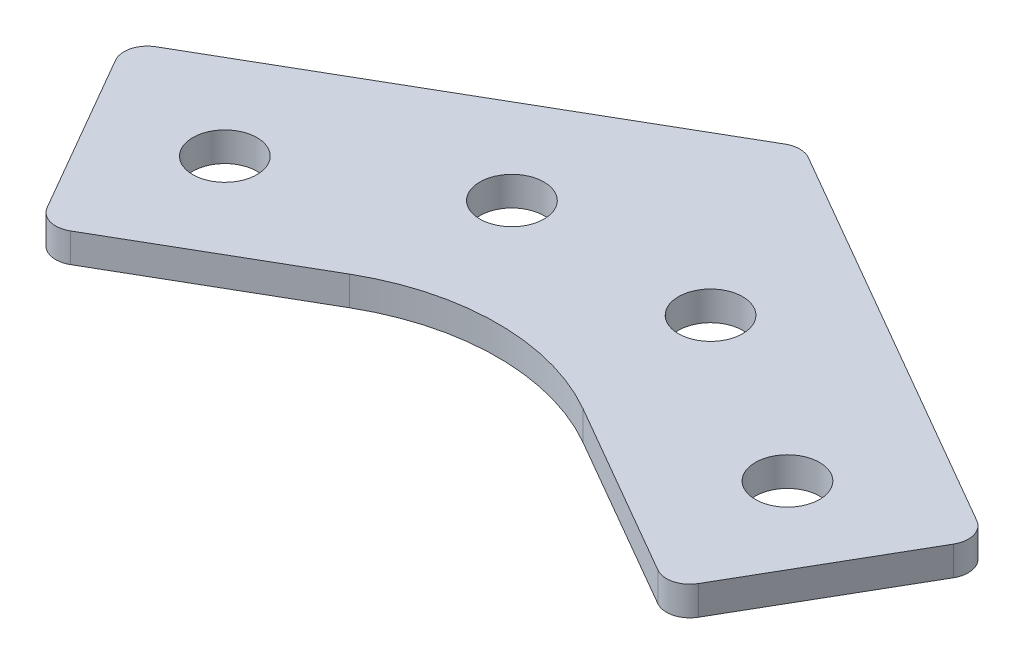
ISO-10303-21;
HEADER;
FILE_DESCRIPTION(('STEP AP214'),'2;1');
FILE_NAME('part.step','',(''),(''),'','','');
FILE_SCHEMA(('AUTOMOTIVE_DESIGN { 1 0 10303 214 1 1 1 1 }'));
ENDSEC;
DATA;
#1=APPLICATION_CONTEXT('core data for automotive mechanical design processes');
#2=APPLICATION_PROTOCOL_DEFINITION('international standard','automotive_design',2000,#1);
#3=PRODUCT_CONTEXT('',#1,'mechanical');
#4=PRODUCT('Part','Part','',(#3));
#5=PRODUCT_RELATED_PRODUCT_CATEGORY('part','',(#4));
#6=PRODUCT_DEFINITION_FORMATION('','',#4);
#7=PRODUCT_DEFINITION_CONTEXT('part definition',#1,'design');
#8=PRODUCT_DEFINITION('design','',#6,#7);
#9=PRODUCT_DEFINITION_SHAPE('','',#8);
#10=(LENGTH_UNIT() NAMED_UNIT(*) SI_UNIT(.MILLI.,.METRE.));
#11=(NAMED_UNIT(*) PLANE_ANGLE_UNIT() SI_UNIT($,.RADIAN.));
#12=(NAMED_UNIT(*) SI_UNIT($,.STERADIAN.) SOLID_ANGLE_UNIT());
#13=UNCERTAINTY_MEASURE_WITH_UNIT(LENGTH_MEASURE(1.E-05),#10,'distance_accuracy_value','');
#14=(GEOMETRIC_REPRESENTATION_CONTEXT(3) GLOBAL_UNCERTAINTY_ASSIGNED_CONTEXT((#13)) GLOBAL_UNIT_ASSIGNED_CONTEXT((#10,
#11,#12)) REPRESENTATION_CONTEXT('',''));
#15=CARTESIAN_POINT('',(0.,0.,0.));
#16=DIRECTION('',(0.,0.,1.));
#17=DIRECTION('',(1.,0.,0.));
#18=AXIS2_PLACEMENT_3D('',#15,#16,#17);
#19=CARTESIAN_POINT('',(-34.1504127601336,3.175,19.71675));
#20=DIRECTION('',(-0.866025403784439,0.,0.5));
#21=DIRECTION('',(0.5,0.,0.866025403784439));
#22=AXIS2_PLACEMENT_3D('',#19,#20,#21);
#23=PLANE('',#22);
#24=DIRECTION('',(-0.5,0.,-0.866025403784439));
#25=VECTOR('',#24,1.);
#26=CARTESIAN_POINT('',(-34.1504127601336,3.175,19.71675));
#27=LINE('',#26,#25);
#28=CARTESIAN_POINT('',(-35.4204127601337,3.175,17.5170454743875));
#29=VERTEX_POINT('',#28);
#30=CARTESIAN_POINT('',(-45.5804127601336,3.175,-0.0805907305122464));
#31=VERTEX_POINT('',#30);
#32=EDGE_CURVE('E230',#29,#31,#27,.T.);
#33=ORIENTED_EDGE('',*,*,#32,.T.);
#34=DIRECTION('',(0.,-1.,0.));
#35=VECTOR('',#34,1.);
#36=CARTESIAN_POINT('',(-45.5804127601336,3.175,-0.0805907305122464));
#37=LINE('',#36,#35);
#38=CARTESIAN_POINT('',(-45.5804127601336,0.,-0.0805907305122464));
#39=VERTEX_POINT('',#38);
#40=EDGE_CURVE('E191',#31,#39,#37,.T.);
#41=ORIENTED_EDGE('',*,*,#40,.T.);
#42=DIRECTION('',(-0.5,0.,-0.866025403784439));
#43=VECTOR('',#42,1.);
#44=CARTESIAN_POINT('',(-34.1504127601336,0.,19.71675));
#45=LINE('',#44,#43);
#46=CARTESIAN_POINT('',(-35.4204127601337,0.,17.5170454743875));
#47=VERTEX_POINT('',#46);
#48=EDGE_CURVE('E131',#47,#39,#45,.T.);
#49=ORIENTED_EDGE('',*,*,#48,.F.);
#50=DIRECTION('',(0.,-1.,0.));
#51=VECTOR('',#50,1.);
#52=CARTESIAN_POINT('',(-35.4204127601337,3.175,17.5170454743875));
#53=LINE('',#52,#51);
#54=EDGE_CURVE('E189',#47,#29,#53,.F.);
#55=ORIENTED_EDGE('',*,*,#54,.T.);
#56=EDGE_LOOP('',(#33,#41,#49,#55));
#57=FACE_BOUND('',#56,.T.);
#58=ADVANCED_FACE('F40',(#57),#23,.T.);
#59=CARTESIAN_POINT('',(0.,3.175,0.));
#60=DIRECTION('',(0.5,0.,0.866025403784438));
#61=DIRECTION('',(0.866025403784439,0.,-0.5));
#62=AXIS2_PLACEMENT_3D('',#59,#60,#61);
#63=PLANE('',#62);
#64=DIRECTION('',(-0.866025403784439,0.,0.5));
#65=VECTOR('',#64,1.);
#66=CARTESIAN_POINT('',(0.,0.,0.));
#67=LINE('',#66,#65);
#68=CARTESIAN_POINT('',(-12.7,0.,7.33234841870828));
#69=VERTEX_POINT('',#68);
#70=CARTESIAN_POINT('',(-31.9507082345212,0.,18.44675));
#71=VERTEX_POINT('',#70);
#72=EDGE_CURVE('E212',#69,#71,#67,.T.);
#73=ORIENTED_EDGE('',*,*,#72,.F.);
#74=DIRECTION('',(0.,-1.,0.));
#75=VECTOR('',#74,1.);
#76=CARTESIAN_POINT('',(-12.7,3.175,7.33234841870827));
#77=LINE('',#76,#75);
#78=CARTESIAN_POINT('',(-12.7,3.175,7.33234841870828));
#79=VERTEX_POINT('',#78);
#80=EDGE_CURVE('E61',#69,#79,#77,.F.);
#81=ORIENTED_EDGE('',*,*,#80,.T.);
#82=DIRECTION('',(-0.866025403784439,0.,0.5));
#83=VECTOR('',#82,1.);
#84=CARTESIAN_POINT('',(0.,3.175,0.));
#85=LINE('',#84,#83);
#86=CARTESIAN_POINT('',(-31.9507082345212,3.175,18.44675));
#87=VERTEX_POINT('',#86);
#88=EDGE_CURVE('E233',#79,#87,#85,.T.);
#89=ORIENTED_EDGE('',*,*,#88,.T.);
#90=DIRECTION('',(0.,-1.,0.));
#91=VECTOR('',#90,1.);
#92=CARTESIAN_POINT('',(-31.9507082345212,3.175,18.44675));
#93=LINE('',#92,#91);
#94=EDGE_CURVE('E193',#87,#71,#93,.T.);
#95=ORIENTED_EDGE('',*,*,#94,.T.);
#96=EDGE_LOOP('',(#73,#81,#89,#95));
#97=FACE_BOUND('',#96,.T.);
#98=ADVANCED_FACE('F298',(#97),#63,.T.);
#99=CARTESIAN_POINT('',(34.1504127601336,3.175,19.7167500000001));
#100=DIRECTION('',(-0.500000000000002,0.,0.866025403784437));
#101=DIRECTION('',(0.866025403784438,0.,0.500000000000002));
#102=AXIS2_PLACEMENT_3D('',#99,#100,#101);
#103=PLANE('',#102);
#104=DIRECTION('',(-0.866025403784437,0.,-0.500000000000002));
#105=VECTOR('',#104,1.);
#106=CARTESIAN_POINT('',(34.1504127601336,3.175,19.7167500000001));
#107=LINE('',#106,#105);
#108=CARTESIAN_POINT('',(31.9507082345211,3.175,18.4467500000001));
#109=VERTEX_POINT('',#108);
#110=CARTESIAN_POINT('',(12.7,3.175,7.33234841870829));
#111=VERTEX_POINT('',#110);
#112=EDGE_CURVE('E207',#109,#111,#107,.T.);
#113=ORIENTED_EDGE('',*,*,#112,.T.);
#114=DIRECTION('',(0.,-1.,0.));
#115=VECTOR('',#114,1.);
#116=CARTESIAN_POINT('',(12.7,0.,7.33234841870829));
#117=LINE('',#116,#115);
#118=CARTESIAN_POINT('',(12.7,0.,7.33234841870829));
#119=VERTEX_POINT('',#118);
#120=EDGE_CURVE('E196',#111,#119,#117,.T.);
#121=ORIENTED_EDGE('',*,*,#120,.T.);
#122=DIRECTION('',(-0.866025403784437,0.,-0.500000000000002));
#123=VECTOR('',#122,1.);
#124=CARTESIAN_POINT('',(34.1504127601336,0.,19.7167500000001));
#125=LINE('',#124,#123);
#126=CARTESIAN_POINT('',(31.9507082345211,0.,18.4467500000001));
#127=VERTEX_POINT('',#126);
#128=EDGE_CURVE('E204',#127,#119,#125,.T.);
#129=ORIENTED_EDGE('',*,*,#128,.F.);
#130=DIRECTION('',(0.,-1.,0.));
#131=VECTOR('',#130,1.);
#132=CARTESIAN_POINT('',(31.9507082345211,3.175,18.4467500000001));
#133=LINE('',#132,#131);
#134=EDGE_CURVE('E187',#127,#109,#133,.F.);
#135=ORIENTED_EDGE('',*,*,#134,.T.);
#136=EDGE_LOOP('',(#113,#121,#129,#135));
#137=FACE_BOUND('',#136,.T.);
#138=ADVANCED_FACE('F203',(#137),#103,.T.);
#139=CARTESIAN_POINT('',(34.1504127601336,3.175,19.7167500000001));
#140=DIRECTION('',(-0.866025403784438,0.,-0.500000000000002));
#141=DIRECTION('',(-0.500000000000002,0.,0.866025403784438));
#142=AXIS2_PLACEMENT_3D('',#139,#140,#141);
#143=PLANE('',#142);
#144=DIRECTION('',(0.500000000000002,0.,-0.866025403784438));
#145=VECTOR('',#144,1.);
#146=CARTESIAN_POINT('',(34.1504127601336,0.,19.7167500000001));
#147=LINE('',#146,#145);
#148=CARTESIAN_POINT('',(35.4204127601336,0.,17.5170454743876));
#149=VERTEX_POINT('',#148);
#150=CARTESIAN_POINT('',(45.5804127601337,0.,-0.0805907305121978));
#151=VERTEX_POINT('',#150);
#152=EDGE_CURVE('E211',#149,#151,#147,.T.);
#153=ORIENTED_EDGE('',*,*,#152,.T.);
#154=DIRECTION('',(0.,-1.,0.));
#155=VECTOR('',#154,1.);
#156=CARTESIAN_POINT('',(45.5804127601337,3.175,-0.0805907305121976));
#157=LINE('',#156,#155);
#158=CARTESIAN_POINT('',(45.5804127601337,3.175,-0.0805907305121978));
#159=VERTEX_POINT('',#158);
#160=EDGE_CURVE('E185',#151,#159,#157,.F.);
#161=ORIENTED_EDGE('',*,*,#160,.T.);
#162=DIRECTION('',(0.500000000000002,0.,-0.866025403784438));
#163=VECTOR('',#162,1.);
#164=CARTESIAN_POINT('',(34.1504127601336,3.175,19.7167500000001));
#165=LINE('',#164,#163);
#166=CARTESIAN_POINT('',(35.4204127601336,3.175,17.5170454743876));
#167=VERTEX_POINT('',#166);
#168=EDGE_CURVE('E157',#167,#159,#165,.T.);
#169=ORIENTED_EDGE('',*,*,#168,.F.);
#170=DIRECTION('',(0.,-1.,0.));
#171=VECTOR('',#170,1.);
#172=CARTESIAN_POINT('',(35.4204127601336,0.,17.5170454743876));
#173=LINE('',#172,#171);
#174=EDGE_CURVE('E182',#167,#149,#173,.T.);
#175=ORIENTED_EDGE('',*,*,#174,.T.);
#176=EDGE_LOOP('',(#153,#161,#169,#175));
#177=FACE_BOUND('',#176,.T.);
#178=ADVANCED_FACE('F333',(#177),#143,.F.);
#179=CARTESIAN_POINT('',(0.,3.175,-29.329393674833));
#180=DIRECTION('',(0.500000000000001,0.,-0.866025403784438));
#181=DIRECTION('',(-0.866025403784438,0.,-0.500000000000001));
#182=AXIS2_PLACEMENT_3D('',#179,#180,#181);
#183=PLANE('',#182);
#184=DIRECTION('',(0.866025403784438,0.,0.500000000000001));
#185=VECTOR('',#184,1.);
#186=CARTESIAN_POINT('',(0.,0.,-29.329393674833));
#187=LINE('',#186,#185);
#188=CARTESIAN_POINT('',(1.27,0.,-28.5961588329622));
#189=VERTEX_POINT('',#188);
#190=CARTESIAN_POINT('',(44.6507082345212,0.,-3.55029525612468));
#191=VERTEX_POINT('',#190);
#192=EDGE_CURVE('E148',#189,#191,#187,.T.);
#193=ORIENTED_EDGE('',*,*,#192,.F.);
#194=DIRECTION('',(0.,-1.,0.));
#195=VECTOR('',#194,1.);
#196=CARTESIAN_POINT('',(1.27,3.175,-28.5961588329622));
#197=LINE('',#196,#195);
#198=CARTESIAN_POINT('',(1.27000000000002,3.175,-28.5961588329622));
#199=VERTEX_POINT('',#198);
#200=EDGE_CURVE('E170',#189,#199,#197,.F.);
#201=ORIENTED_EDGE('',*,*,#200,.T.);
#202=DIRECTION('',(-0.866025403784437,0.,-0.500000000000002));
#203=VECTOR('',#202,1.);
#204=CARTESIAN_POINT('',(46.8504127601337,3.175,-2.28029525612464));
#205=LINE('',#204,#203);
#206=CARTESIAN_POINT('',(44.6507082345212,3.175,-3.55029525612465));
#207=VERTEX_POINT('',#206);
#208=EDGE_CURVE('E153',#207,#199,#205,.T.);
#209=ORIENTED_EDGE('',*,*,#208,.F.);
#210=DIRECTION('',(0.,-1.,0.));
#211=VECTOR('',#210,1.);
#212=CARTESIAN_POINT('',(44.6507082345212,0.,-3.55029525612467));
#213=LINE('',#212,#211);
#214=EDGE_CURVE('E167',#207,#191,#213,.T.);
#215=ORIENTED_EDGE('',*,*,#214,.T.);
#216=EDGE_LOOP('',(#193,#201,#209,#215));
#217=FACE_BOUND('',#216,.T.);
#218=ADVANCED_FACE('F222',(#217),#183,.T.);
#219=CARTESIAN_POINT('',(-25.3999999999999,3.175,-14.6646968374165));
#220=DIRECTION('',(-0.500000000000001,0.,-0.866025403784438));
#221=DIRECTION('',(-0.866025403784438,0.,0.500000000000001));
#222=AXIS2_PLACEMENT_3D('',#219,#220,#221);
#223=PLANE('',#222);
#224=DIRECTION('',(-0.866025403784438,0.,0.5));
#225=VECTOR('',#224,1.);
#226=CARTESIAN_POINT('',(-25.3999999999999,3.175,-14.6646968374165));
#227=LINE('',#226,#225);
#228=CARTESIAN_POINT('',(-1.27,3.175,-28.5961588329622));
#229=VERTEX_POINT('',#228);
#230=CARTESIAN_POINT('',(-44.6507082345212,3.175,-3.55029525612473));
#231=VERTEX_POINT('',#230);
#232=EDGE_CURVE('E147',#229,#231,#227,.T.);
#233=ORIENTED_EDGE('',*,*,#232,.F.);
#234=DIRECTION('',(0.,-1.,0.));
#235=VECTOR('',#234,1.);
#236=CARTESIAN_POINT('',(-1.27,3.175,-28.5961588329622));
#237=LINE('',#236,#235);
#238=CARTESIAN_POINT('',(-1.27,0.,-28.5961588329622));
#239=VERTEX_POINT('',#238);
#240=EDGE_CURVE('E146',#229,#239,#237,.T.);
#241=ORIENTED_EDGE('',*,*,#240,.T.);
#242=DIRECTION('',(0.866025403784438,0.,-0.500000000000001));
#243=VECTOR('',#242,1.);
#244=CARTESIAN_POINT('',(-25.3999999999999,0.,-14.6646968374165));
#245=LINE('',#244,#243);
#246=CARTESIAN_POINT('',(-44.6507082345212,0.,-3.55029525612473));
#247=VERTEX_POINT('',#246);
#248=EDGE_CURVE('E129',#247,#239,#245,.T.);
#249=ORIENTED_EDGE('',*,*,#248,.F.);
#250=DIRECTION('',(0.,-1.,0.));
#251=VECTOR('',#250,1.);
#252=CARTESIAN_POINT('',(-44.6507082345212,3.175,-3.55029525612473));
#253=LINE('',#252,#251);
#254=EDGE_CURVE('E143',#247,#231,#253,.F.);
#255=ORIENTED_EDGE('',*,*,#254,.T.);
#256=EDGE_LOOP('',(#233,#241,#249,#255));
#257=FACE_BOUND('',#256,.T.);
#258=ADVANCED_FACE('F142',(#257),#223,.T.);
#259=CARTESIAN_POINT('',(0.,3.175,0.));
#260=DIRECTION('',(0.,-1.,0.));
#261=DIRECTION('',(0.,0.,-1.));
#262=AXIS2_PLACEMENT_3D('',#259,#260,#261);
#263=PLANE('',#262);
#264=CARTESIAN_POINT('',(10.8044016643653,3.175,-8.42677262806234));
#265=DIRECTION('',(0.,1.,0.));
#266=DIRECTION('',(0.,0.,1.));
#267=AXIS2_PLACEMENT_3D('',#264,#265,#266);
#268=CIRCLE('',#267,3.4925);
#269=CARTESIAN_POINT('',(10.8044016643653,3.175,-4.93427262806234));
#270=VERTEX_POINT('',#269);
#271=EDGE_CURVE('E261',#270,#270,#268,.T.);
#272=ORIENTED_EDGE('',*,*,#271,.F.);
#273=EDGE_LOOP('',(#272));
#274=FACE_BOUND('',#273,.T.);
#275=CARTESIAN_POINT('',(30.6017423948775,3.175,3.0032273719377));
#276=DIRECTION('',(0.,1.,0.));
#277=DIRECTION('',(0.,0.,1.));
#278=AXIS2_PLACEMENT_3D('',#275,#276,#277);
#279=CIRCLE('',#278,3.4925);
#280=CARTESIAN_POINT('',(30.6017423948775,3.175,6.4957273719377));
#281=VERTEX_POINT('',#280);
#282=EDGE_CURVE('E255',#281,#281,#279,.T.);
#283=ORIENTED_EDGE('',*,*,#282,.F.);
#284=EDGE_LOOP('',(#283));
#285=FACE_BOUND('',#284,.T.);
#286=CARTESIAN_POINT('',(-10.8044016643653,3.175,-8.42677262806237));
#287=DIRECTION('',(0.,1.,0.));
#288=DIRECTION('',(0.,0.,1.));
#289=AXIS2_PLACEMENT_3D('',#286,#287,#288);
#290=CIRCLE('',#289,3.49250000000001);
#291=CARTESIAN_POINT('',(-10.8044016643653,3.175,-4.93427262806237));
#292=VERTEX_POINT('',#291);
#293=EDGE_CURVE('E249',#292,#292,#290,.T.);
#294=ORIENTED_EDGE('',*,*,#293,.F.);
#295=EDGE_LOOP('',(#294));
#296=FACE_BOUND('',#295,.T.);
#297=CARTESIAN_POINT('',(-30.6017423948775,3.175,3.00322737193764));
#298=DIRECTION('',(0.,1.,0.));
#299=DIRECTION('',(0.,0.,1.));
#300=AXIS2_PLACEMENT_3D('',#297,#298,#299);
#301=CIRCLE('',#300,3.49250000000001);
#302=CARTESIAN_POINT('',(-30.6017423948775,3.175,6.49572737193764));
#303=VERTEX_POINT('',#302);
#304=EDGE_CURVE('E236',#303,#303,#301,.T.);
#305=ORIENTED_EDGE('',*,*,#304,.F.);
#306=EDGE_LOOP('',(#305));
#307=FACE_BOUND('',#306,.T.);
#308=ORIENTED_EDGE('',*,*,#208,.T.);
#309=CARTESIAN_POINT('',(0.,3.175,-26.3964543073497));
#310=DIRECTION('',(0.,-1.,0.));
#311=DIRECTION('',(0.,0.,-1.));
#312=AXIS2_PLACEMENT_3D('',#309,#310,#311);
#313=CIRCLE('',#312,2.54);
#314=EDGE_CURVE('E180',#199,#229,#313,.F.);
#315=ORIENTED_EDGE('',*,*,#314,.T.);
#316=ORIENTED_EDGE('',*,*,#232,.T.);
#317=CARTESIAN_POINT('',(-43.3807082345212,3.175,-1.35059073051225));
#318=DIRECTION('',(0.,-1.,0.));
#319=DIRECTION('',(0.,0.,-1.));
#320=AXIS2_PLACEMENT_3D('',#317,#318,#319);
#321=CIRCLE('',#320,2.54);
#322=EDGE_CURVE('E152',#231,#31,#321,.F.);
#323=ORIENTED_EDGE('',*,*,#322,.T.);
#324=ORIENTED_EDGE('',*,*,#32,.F.);
#325=CARTESIAN_POINT('',(-33.2207082345212,3.175,16.2470454743875));
#326=DIRECTION('',(0.,-1.,0.));
#327=DIRECTION('',(0.,0.,-1.));
#328=AXIS2_PLACEMENT_3D('',#325,#326,#327);
#329=CIRCLE('',#328,2.54);
#330=EDGE_CURVE('E172',#29,#87,#329,.F.);
#331=ORIENTED_EDGE('',*,*,#330,.T.);
#332=ORIENTED_EDGE('',*,*,#88,.F.);
#333=CARTESIAN_POINT('',(0.,3.175,29.329393674833));
#334=DIRECTION('',(0.,-1.,0.));
#335=DIRECTION('',(0.,0.,-1.));
#336=AXIS2_PLACEMENT_3D('',#333,#334,#335);
#337=CIRCLE('',#336,25.4);
#338=EDGE_CURVE('E11',#79,#111,#337,.T.);
#339=ORIENTED_EDGE('',*,*,#338,.T.);
#340=ORIENTED_EDGE('',*,*,#112,.F.);
#341=CARTESIAN_POINT('',(33.2207082345211,3.175,16.2470454743876));
#342=DIRECTION('',(0.,-1.,0.));
#343=DIRECTION('',(0.,0.,-1.));
#344=AXIS2_PLACEMENT_3D('',#341,#342,#343);
#345=CIRCLE('',#344,2.54);
#346=EDGE_CURVE('E176',#109,#167,#345,.F.);
#347=ORIENTED_EDGE('',*,*,#346,.T.);
#348=ORIENTED_EDGE('',*,*,#168,.T.);
#349=CARTESIAN_POINT('',(43.3807082345212,3.175,-1.3505907305122));
#350=DIRECTION('',(0.,-1.,0.));
#351=DIRECTION('',(0.,0.,-1.));
#352=AXIS2_PLACEMENT_3D('',#349,#350,#351);
#353=CIRCLE('',#352,2.54);
#354=EDGE_CURVE('E178',#159,#207,#353,.F.);
#355=ORIENTED_EDGE('',*,*,#354,.T.);
#356=EDGE_LOOP('',(#308,#315,#316,#323,#324,#331,#332,#339,#340,#347,#348,#355));
#357=FACE_BOUND('',#356,.T.);
#358=ADVANCED_FACE('F229',(#274,#285,#296,#307,#357),#263,.F.);
#359=CARTESIAN_POINT('',(0.,0.,0.));
#360=DIRECTION('',(0.,-1.,0.));
#361=DIRECTION('',(0.,0.,-1.));
#362=AXIS2_PLACEMENT_3D('',#359,#360,#361);
#363=PLANE('',#362);
#364=CARTESIAN_POINT('',(10.8044016643653,0.,-8.42677262806234));
#365=DIRECTION('',(0.,1.,0.));
#366=DIRECTION('',(0.,0.,1.));
#367=AXIS2_PLACEMENT_3D('',#364,#365,#366);
#368=CIRCLE('',#367,3.4925);
#369=CARTESIAN_POINT('',(10.8044016643653,0.,-4.93427262806234));
#370=VERTEX_POINT('',#369);
#371=EDGE_CURVE('E258',#370,#370,#368,.T.);
#372=ORIENTED_EDGE('',*,*,#371,.T.);
#373=EDGE_LOOP('',(#372));
#374=FACE_BOUND('',#373,.T.);
#375=CARTESIAN_POINT('',(30.6017423948775,0.,3.0032273719377));
#376=DIRECTION('',(0.,1.,0.));
#377=DIRECTION('',(0.,0.,1.));
#378=AXIS2_PLACEMENT_3D('',#375,#376,#377);
#379=CIRCLE('',#378,3.4925);
#380=CARTESIAN_POINT('',(30.6017423948775,0.,6.4957273719377));
#381=VERTEX_POINT('',#380);
#382=EDGE_CURVE('E252',#381,#381,#379,.T.);
#383=ORIENTED_EDGE('',*,*,#382,.T.);
#384=EDGE_LOOP('',(#383));
#385=FACE_BOUND('',#384,.T.);
#386=CARTESIAN_POINT('',(-10.8044016643653,0.,-8.42677262806237));
#387=DIRECTION('',(0.,1.,0.));
#388=DIRECTION('',(0.,0.,1.));
#389=AXIS2_PLACEMENT_3D('',#386,#387,#388);
#390=CIRCLE('',#389,3.49250000000001);
#391=CARTESIAN_POINT('',(-10.8044016643653,0.,-4.93427262806237));
#392=VERTEX_POINT('',#391);
#393=EDGE_CURVE('E247',#392,#392,#390,.T.);
#394=ORIENTED_EDGE('',*,*,#393,.T.);
#395=EDGE_LOOP('',(#394));
#396=FACE_BOUND('',#395,.T.);
#397=CARTESIAN_POINT('',(-30.6017423948775,0.,3.00322737193764));
#398=DIRECTION('',(0.,1.,0.));
#399=DIRECTION('',(0.,0.,1.));
#400=AXIS2_PLACEMENT_3D('',#397,#398,#399);
#401=CIRCLE('',#400,3.49250000000001);
#402=CARTESIAN_POINT('',(-30.6017423948775,0.,6.49572737193764));
#403=VERTEX_POINT('',#402);
#404=EDGE_CURVE('E242',#403,#403,#401,.T.);
#405=ORIENTED_EDGE('',*,*,#404,.T.);
#406=EDGE_LOOP('',(#405));
#407=FACE_BOUND('',#406,.T.);
#408=ORIENTED_EDGE('',*,*,#248,.T.);
#409=CARTESIAN_POINT('',(0.,0.,-26.3964543073497));
#410=DIRECTION('',(0.,-1.,0.));
#411=DIRECTION('',(0.,0.,-1.));
#412=AXIS2_PLACEMENT_3D('',#409,#410,#411);
#413=CIRCLE('',#412,2.54);
#414=EDGE_CURVE('E165',#239,#189,#413,.T.);
#415=ORIENTED_EDGE('',*,*,#414,.T.);
#416=ORIENTED_EDGE('',*,*,#192,.T.);
#417=CARTESIAN_POINT('',(43.3807082345212,0.,-1.3505907305122));
#418=DIRECTION('',(0.,-1.,0.));
#419=DIRECTION('',(0.,0.,-1.));
#420=AXIS2_PLACEMENT_3D('',#417,#418,#419);
#421=CIRCLE('',#420,2.54);
#422=EDGE_CURVE('E163',#191,#151,#421,.T.);
#423=ORIENTED_EDGE('',*,*,#422,.T.);
#424=ORIENTED_EDGE('',*,*,#152,.F.);
#425=CARTESIAN_POINT('',(33.2207082345211,0.,16.2470454743876));
#426=DIRECTION('',(0.,-1.,0.));
#427=DIRECTION('',(0.,0.,-1.));
#428=AXIS2_PLACEMENT_3D('',#425,#426,#427);
#429=CIRCLE('',#428,2.54);
#430=EDGE_CURVE('E136',#149,#127,#429,.T.);
#431=ORIENTED_EDGE('',*,*,#430,.T.);
#432=ORIENTED_EDGE('',*,*,#128,.T.);
#433=CARTESIAN_POINT('',(0.,0.,29.329393674833));
#434=DIRECTION('',(0.,-1.,0.));
#435=DIRECTION('',(0.,0.,-1.));
#436=AXIS2_PLACEMENT_3D('',#433,#434,#435);
#437=CIRCLE('',#436,25.4);
#438=EDGE_CURVE('E48',#119,#69,#437,.F.);
#439=ORIENTED_EDGE('',*,*,#438,.T.);
#440=ORIENTED_EDGE('',*,*,#72,.T.);
#441=CARTESIAN_POINT('',(-33.2207082345212,0.,16.2470454743875));
#442=DIRECTION('',(0.,-1.,0.));
#443=DIRECTION('',(0.,0.,-1.));
#444=AXIS2_PLACEMENT_3D('',#441,#442,#443);
#445=CIRCLE('',#444,2.54);
#446=EDGE_CURVE('E137',#71,#47,#445,.T.);
#447=ORIENTED_EDGE('',*,*,#446,.T.);
#448=ORIENTED_EDGE('',*,*,#48,.T.);
#449=CARTESIAN_POINT('',(-43.3807082345212,0.,-1.35059073051225));
#450=DIRECTION('',(0.,-1.,0.));
#451=DIRECTION('',(0.,0.,-1.));
#452=AXIS2_PLACEMENT_3D('',#449,#450,#451);
#453=CIRCLE('',#452,2.54);
#454=EDGE_CURVE('E126',#39,#247,#453,.T.);
#455=ORIENTED_EDGE('',*,*,#454,.T.);
#456=EDGE_LOOP('',(#408,#415,#416,#423,#424,#431,#432,#439,#440,#447,#448,#455));
#457=FACE_BOUND('',#456,.T.);
#458=ADVANCED_FACE('F128',(#374,#385,#396,#407,#457),#363,.T.);
#459=CARTESIAN_POINT('',(-30.6017423948775,0.,3.00322737193764));
#460=DIRECTION('',(0.,1.,0.));
#461=DIRECTION('',(0.,0.,1.));
#462=AXIS2_PLACEMENT_3D('',#459,#460,#461);
#463=CYLINDRICAL_SURFACE('',#462,3.49250000000001);
#464=ORIENTED_EDGE('',*,*,#404,.F.);
#465=EDGE_LOOP('',(#464));
#466=FACE_BOUND('',#465,.T.);
#467=ORIENTED_EDGE('',*,*,#304,.T.);
#468=EDGE_LOOP('',(#467));
#469=FACE_BOUND('',#468,.T.);
#470=ADVANCED_FACE('F285',(#466,#469),#463,.F.);
#471=CARTESIAN_POINT('',(-10.8044016643653,0.,-8.42677262806237));
#472=DIRECTION('',(0.,1.,0.));
#473=DIRECTION('',(0.,0.,1.));
#474=AXIS2_PLACEMENT_3D('',#471,#472,#473);
#475=CYLINDRICAL_SURFACE('',#474,3.49250000000001);
#476=ORIENTED_EDGE('',*,*,#393,.F.);
#477=EDGE_LOOP('',(#476));
#478=FACE_BOUND('',#477,.T.);
#479=ORIENTED_EDGE('',*,*,#293,.T.);
#480=EDGE_LOOP('',(#479));
#481=FACE_BOUND('',#480,.T.);
#482=ADVANCED_FACE('F287',(#478,#481),#475,.F.);
#483=CARTESIAN_POINT('',(30.6017423948775,0.,3.0032273719377));
#484=DIRECTION('',(0.,1.,0.));
#485=DIRECTION('',(0.,0.,1.));
#486=AXIS2_PLACEMENT_3D('',#483,#484,#485);
#487=CYLINDRICAL_SURFACE('',#486,3.4925);
#488=ORIENTED_EDGE('',*,*,#382,.F.);
#489=EDGE_LOOP('',(#488));
#490=FACE_BOUND('',#489,.T.);
#491=ORIENTED_EDGE('',*,*,#282,.T.);
#492=EDGE_LOOP('',(#491));
#493=FACE_BOUND('',#492,.T.);
#494=ADVANCED_FACE('F272',(#490,#493),#487,.F.);
#495=CARTESIAN_POINT('',(10.8044016643653,0.,-8.42677262806234));
#496=DIRECTION('',(0.,1.,0.));
#497=DIRECTION('',(0.,0.,1.));
#498=AXIS2_PLACEMENT_3D('',#495,#496,#497);
#499=CYLINDRICAL_SURFACE('',#498,3.4925);
#500=ORIENTED_EDGE('',*,*,#371,.F.);
#501=EDGE_LOOP('',(#500));
#502=FACE_BOUND('',#501,.T.);
#503=ORIENTED_EDGE('',*,*,#271,.T.);
#504=EDGE_LOOP('',(#503));
#505=FACE_BOUND('',#504,.T.);
#506=ADVANCED_FACE('F269',(#502,#505),#499,.F.);
#507=CARTESIAN_POINT('',(0.,3.175,-26.3964543073497));
#508=DIRECTION('',(0.,-1.,0.));
#509=DIRECTION('',(0.,0.,-1.));
#510=AXIS2_PLACEMENT_3D('',#507,#508,#509);
#511=CYLINDRICAL_SURFACE('',#510,2.54);
#512=ORIENTED_EDGE('',*,*,#314,.F.);
#513=ORIENTED_EDGE('',*,*,#200,.F.);
#514=ORIENTED_EDGE('',*,*,#414,.F.);
#515=ORIENTED_EDGE('',*,*,#240,.F.);
#516=EDGE_LOOP('',(#512,#513,#514,#515));
#517=FACE_BOUND('',#516,.T.);
#518=ADVANCED_FACE('F227',(#517),#511,.T.);
#519=CARTESIAN_POINT('',(43.3807082345212,3.175,-1.3505907305122));
#520=DIRECTION('',(0.,1.,0.));
#521=DIRECTION('',(0.,0.,1.));
#522=AXIS2_PLACEMENT_3D('',#519,#520,#521);
#523=CYLINDRICAL_SURFACE('',#522,2.54);
#524=ORIENTED_EDGE('',*,*,#354,.F.);
#525=ORIENTED_EDGE('',*,*,#160,.F.);
#526=ORIENTED_EDGE('',*,*,#422,.F.);
#527=ORIENTED_EDGE('',*,*,#214,.F.);
#528=EDGE_LOOP('',(#524,#525,#526,#527));
#529=FACE_BOUND('',#528,.T.);
#530=ADVANCED_FACE('F309',(#529),#523,.T.);
#531=CARTESIAN_POINT('',(33.2207082345211,3.175,16.2470454743876));
#532=DIRECTION('',(0.,1.,0.));
#533=DIRECTION('',(0.,0.,1.));
#534=AXIS2_PLACEMENT_3D('',#531,#532,#533);
#535=CYLINDRICAL_SURFACE('',#534,2.54);
#536=ORIENTED_EDGE('',*,*,#346,.F.);
#537=ORIENTED_EDGE('',*,*,#134,.F.);
#538=ORIENTED_EDGE('',*,*,#430,.F.);
#539=ORIENTED_EDGE('',*,*,#174,.F.);
#540=EDGE_LOOP('',(#536,#537,#538,#539));
#541=FACE_BOUND('',#540,.T.);
#542=ADVANCED_FACE('F312',(#541),#535,.T.);
#543=CARTESIAN_POINT('',(-43.3807082345212,3.175,-1.35059073051225));
#544=DIRECTION('',(0.,-1.,0.));
#545=DIRECTION('',(0.,0.,-1.));
#546=AXIS2_PLACEMENT_3D('',#543,#544,#545);
#547=CYLINDRICAL_SURFACE('',#546,2.54);
#548=ORIENTED_EDGE('',*,*,#322,.F.);
#549=ORIENTED_EDGE('',*,*,#254,.F.);
#550=ORIENTED_EDGE('',*,*,#454,.F.);
#551=ORIENTED_EDGE('',*,*,#40,.F.);
#552=EDGE_LOOP('',(#548,#549,#550,#551));
#553=FACE_BOUND('',#552,.T.);
#554=ADVANCED_FACE('F151',(#553),#547,.T.);
#555=CARTESIAN_POINT('',(-33.2207082345212,3.175,16.2470454743875));
#556=DIRECTION('',(0.,-1.,0.));
#557=DIRECTION('',(0.,0.,-1.));
#558=AXIS2_PLACEMENT_3D('',#555,#556,#557);
#559=CYLINDRICAL_SURFACE('',#558,2.54);
#560=ORIENTED_EDGE('',*,*,#330,.F.);
#561=ORIENTED_EDGE('',*,*,#54,.F.);
#562=ORIENTED_EDGE('',*,*,#446,.F.);
#563=ORIENTED_EDGE('',*,*,#94,.F.);
#564=EDGE_LOOP('',(#560,#561,#562,#563));
#565=FACE_BOUND('',#564,.T.);
#566=ADVANCED_FACE('F318',(#565),#559,.T.);
#567=CARTESIAN_POINT('',(0.,3.175,29.329393674833));
#568=DIRECTION('',(0.,1.,0.));
#569=DIRECTION('',(0.,0.,1.));
#570=AXIS2_PLACEMENT_3D('',#567,#568,#569);
#571=CYLINDRICAL_SURFACE('',#570,25.4);
#572=ORIENTED_EDGE('',*,*,#338,.F.);
#573=ORIENTED_EDGE('',*,*,#80,.F.);
#574=ORIENTED_EDGE('',*,*,#438,.F.);
#575=ORIENTED_EDGE('',*,*,#120,.F.);
#576=EDGE_LOOP('',(#572,#573,#574,#575));
#577=FACE_BOUND('',#576,.T.);
#578=ADVANCED_FACE('F42',(#577),#571,.F.);
#579=CLOSED_SHELL('',(#58,#98,#138,#178,#218,#258,#358,#458,#470,#482,#494,#506,#518,#530,#542,
#554,#566,#578));
#580=MANIFOLD_SOLID_BREP('B2',#579);
#581=ADVANCED_BREP_SHAPE_REPRESENTATION('',(#18,#580),#14);
#582=SHAPE_DEFINITION_REPRESENTATION(#9,#581);
ENDSEC;
END-ISO-10303-21;
